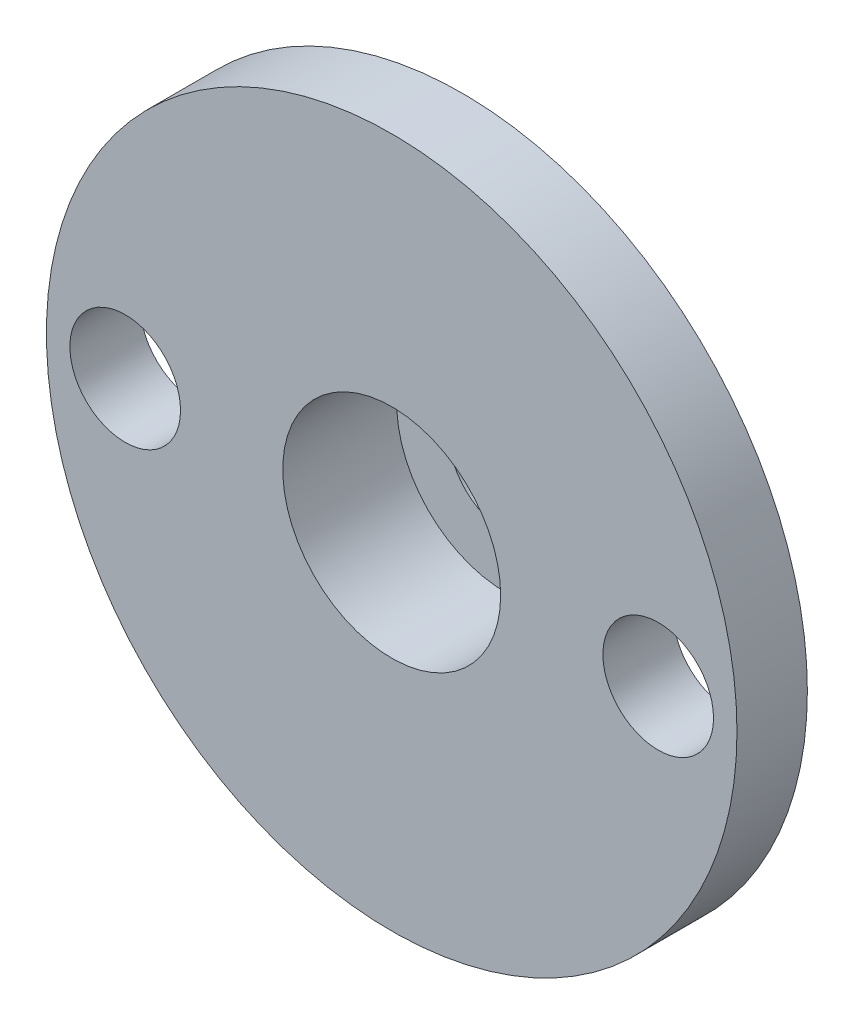
ISO-10303-21;
HEADER;
FILE_DESCRIPTION(('STEP AP214'),'2;1');
FILE_NAME('part.step','',(''),(''),'','','');
FILE_SCHEMA(('AUTOMOTIVE_DESIGN { 1 0 10303 214 1 1 1 1 }'));
ENDSEC;
DATA;
#1=APPLICATION_CONTEXT('core data for automotive mechanical design processes');
#2=APPLICATION_PROTOCOL_DEFINITION('international standard','automotive_design',2000,#1);
#3=PRODUCT_CONTEXT('',#1,'mechanical');
#4=PRODUCT('Part','Part','',(#3));
#5=PRODUCT_RELATED_PRODUCT_CATEGORY('part','',(#4));
#6=PRODUCT_DEFINITION_FORMATION('','',#4);
#7=PRODUCT_DEFINITION_CONTEXT('part definition',#1,'design');
#8=PRODUCT_DEFINITION('design','',#6,#7);
#9=PRODUCT_DEFINITION_SHAPE('','',#8);
#10=(LENGTH_UNIT() NAMED_UNIT(*) SI_UNIT(.MILLI.,.METRE.));
#11=(NAMED_UNIT(*) PLANE_ANGLE_UNIT() SI_UNIT($,.RADIAN.));
#12=(NAMED_UNIT(*) SI_UNIT($,.STERADIAN.) SOLID_ANGLE_UNIT());
#13=UNCERTAINTY_MEASURE_WITH_UNIT(LENGTH_MEASURE(1.E-05),#10,'distance_accuracy_value','');
#14=(GEOMETRIC_REPRESENTATION_CONTEXT(3) GLOBAL_UNCERTAINTY_ASSIGNED_CONTEXT((#13)) GLOBAL_UNIT_ASSIGNED_CONTEXT((#10,
#11,#12)) REPRESENTATION_CONTEXT('',''));
#15=CARTESIAN_POINT('',(0.,0.,0.));
#16=DIRECTION('',(0.,0.,1.));
#17=DIRECTION('',(1.,0.,0.));
#18=AXIS2_PLACEMENT_3D('',#15,#16,#17);
#19=CARTESIAN_POINT('',(0.,0.,2.1));
#20=DIRECTION('',(0.,0.,-1.));
#21=DIRECTION('',(-1.,0.,0.));
#22=AXIS2_PLACEMENT_3D('',#19,#20,#21);
#23=CYLINDRICAL_SURFACE('',#22,10.3);
#24=CARTESIAN_POINT('',(0.,0.,2.1));
#25=DIRECTION('',(0.,0.,1.));
#26=DIRECTION('',(1.,0.,0.));
#27=AXIS2_PLACEMENT_3D('',#24,#25,#26);
#28=CIRCLE('',#27,10.3);
#29=CARTESIAN_POINT('',(10.3,0.,2.1));
#30=VERTEX_POINT('',#29);
#31=EDGE_CURVE('E10',#30,#30,#28,.T.);
#32=ORIENTED_EDGE('',*,*,#31,.F.);
#33=EDGE_LOOP('',(#32));
#34=FACE_BOUND('',#33,.T.);
#35=CARTESIAN_POINT('',(0.,0.,0.));
#36=DIRECTION('',(0.,0.,1.));
#37=DIRECTION('',(1.,0.,0.));
#38=AXIS2_PLACEMENT_3D('',#35,#36,#37);
#39=CIRCLE('',#38,10.3);
#40=CARTESIAN_POINT('',(10.3,0.,0.));
#41=VERTEX_POINT('',#40);
#42=EDGE_CURVE('E42',#41,#41,#39,.T.);
#43=ORIENTED_EDGE('',*,*,#42,.T.);
#44=EDGE_LOOP('',(#43));
#45=FACE_BOUND('',#44,.T.);
#46=ADVANCED_FACE('F35',(#34,#45),#23,.T.);
#47=CARTESIAN_POINT('',(0.,0.,2.1));
#48=DIRECTION('',(0.,0.,1.));
#49=DIRECTION('',(1.,0.,0.));
#50=AXIS2_PLACEMENT_3D('',#47,#48,#49);
#51=PLANE('',#50);
#52=CARTESIAN_POINT('',(0.,0.,2.1));
#53=DIRECTION('',(0.,0.,1.));
#54=DIRECTION('',(1.,0.,0.));
#55=AXIS2_PLACEMENT_3D('',#52,#53,#54);
#56=CIRCLE('',#55,3.25);
#57=CARTESIAN_POINT('',(3.25,0.,2.1));
#58=VERTEX_POINT('',#57);
#59=EDGE_CURVE('E104',#58,#58,#56,.T.);
#60=ORIENTED_EDGE('',*,*,#59,.F.);
#61=EDGE_LOOP('',(#60));
#62=FACE_BOUND('',#61,.T.);
#63=CARTESIAN_POINT('',(7.95,0.,2.1));
#64=DIRECTION('',(0.,0.,1.));
#65=DIRECTION('',(1.,0.,0.));
#66=AXIS2_PLACEMENT_3D('',#63,#64,#65);
#67=CIRCLE('',#66,1.65);
#68=CARTESIAN_POINT('',(9.6,0.,2.1));
#69=VERTEX_POINT('',#68);
#70=EDGE_CURVE('E54',#69,#69,#67,.T.);
#71=ORIENTED_EDGE('',*,*,#70,.F.);
#72=EDGE_LOOP('',(#71));
#73=FACE_BOUND('',#72,.T.);
#74=CARTESIAN_POINT('',(-7.95,0.,2.1));
#75=DIRECTION('',(0.,0.,1.));
#76=DIRECTION('',(1.,0.,0.));
#77=AXIS2_PLACEMENT_3D('',#74,#75,#76);
#78=CIRCLE('',#77,1.65);
#79=CARTESIAN_POINT('',(-6.3,0.,2.1));
#80=VERTEX_POINT('',#79);
#81=EDGE_CURVE('E59',#80,#80,#78,.T.);
#82=ORIENTED_EDGE('',*,*,#81,.F.);
#83=EDGE_LOOP('',(#82));
#84=FACE_BOUND('',#83,.T.);
#85=ORIENTED_EDGE('',*,*,#31,.T.);
#86=EDGE_LOOP('',(#85));
#87=FACE_BOUND('',#86,.T.);
#88=ADVANCED_FACE('F88',(#62,#73,#84,#87),#51,.T.);
#89=CARTESIAN_POINT('',(0.,0.,0.));
#90=DIRECTION('',(0.,0.,1.));
#91=DIRECTION('',(1.,0.,0.));
#92=AXIS2_PLACEMENT_3D('',#89,#90,#91);
#93=PLANE('',#92);
#94=CARTESIAN_POINT('',(7.95,0.,0.));
#95=DIRECTION('',(0.,0.,1.));
#96=DIRECTION('',(1.,0.,0.));
#97=AXIS2_PLACEMENT_3D('',#94,#95,#96);
#98=CIRCLE('',#97,1.65);
#99=CARTESIAN_POINT('',(9.6,0.,0.));
#100=VERTEX_POINT('',#99);
#101=EDGE_CURVE('E38',#100,#100,#98,.T.);
#102=ORIENTED_EDGE('',*,*,#101,.T.);
#103=EDGE_LOOP('',(#102));
#104=FACE_BOUND('',#103,.T.);
#105=CARTESIAN_POINT('',(-7.95,0.,0.));
#106=DIRECTION('',(0.,0.,1.));
#107=DIRECTION('',(1.,0.,0.));
#108=AXIS2_PLACEMENT_3D('',#105,#106,#107);
#109=CIRCLE('',#108,1.65);
#110=CARTESIAN_POINT('',(-6.3,0.,0.));
#111=VERTEX_POINT('',#110);
#112=EDGE_CURVE('E52',#111,#111,#109,.T.);
#113=ORIENTED_EDGE('',*,*,#112,.T.);
#114=EDGE_LOOP('',(#113));
#115=FACE_BOUND('',#114,.T.);
#116=CARTESIAN_POINT('',(0.,0.,0.));
#117=DIRECTION('',(0.,0.,1.));
#118=DIRECTION('',(1.,0.,0.));
#119=AXIS2_PLACEMENT_3D('',#116,#117,#118);
#120=CIRCLE('',#119,4.8);
#121=CARTESIAN_POINT('',(4.8,0.,0.));
#122=VERTEX_POINT('',#121);
#123=EDGE_CURVE('E50',#122,#122,#120,.T.);
#124=ORIENTED_EDGE('',*,*,#123,.T.);
#125=EDGE_LOOP('',(#124));
#126=FACE_BOUND('',#125,.T.);
#127=ORIENTED_EDGE('',*,*,#42,.F.);
#128=EDGE_LOOP('',(#127));
#129=FACE_BOUND('',#128,.T.);
#130=ADVANCED_FACE('F74',(#104,#115,#126,#129),#93,.F.);
#131=CARTESIAN_POINT('',(0.,0.,-3.3));
#132=DIRECTION('',(0.,0.,1.));
#133=DIRECTION('',(1.,0.,0.));
#134=AXIS2_PLACEMENT_3D('',#131,#132,#133);
#135=CYLINDRICAL_SURFACE('',#134,4.8);
#136=CARTESIAN_POINT('',(0.,0.,-3.3));
#137=DIRECTION('',(0.,0.,1.));
#138=DIRECTION('',(1.,0.,0.));
#139=AXIS2_PLACEMENT_3D('',#136,#137,#138);
#140=CIRCLE('',#139,4.8);
#141=CARTESIAN_POINT('',(4.8,0.,-3.3));
#142=VERTEX_POINT('',#141);
#143=EDGE_CURVE('E47',#142,#142,#140,.T.);
#144=ORIENTED_EDGE('',*,*,#143,.T.);
#145=EDGE_LOOP('',(#144));
#146=FACE_BOUND('',#145,.T.);
#147=ORIENTED_EDGE('',*,*,#123,.F.);
#148=EDGE_LOOP('',(#147));
#149=FACE_BOUND('',#148,.T.);
#150=ADVANCED_FACE('F77',(#146,#149),#135,.T.);
#151=CARTESIAN_POINT('',(0.,0.,-3.3));
#152=DIRECTION('',(0.,0.,1.));
#153=DIRECTION('',(1.,0.,0.));
#154=AXIS2_PLACEMENT_3D('',#151,#152,#153);
#155=PLANE('',#154);
#156=CARTESIAN_POINT('',(0.,0.,-3.3));
#157=DIRECTION('',(0.,0.,1.));
#158=DIRECTION('',(1.,0.,0.));
#159=AXIS2_PLACEMENT_3D('',#156,#157,#158);
#160=CIRCLE('',#159,1.7);
#161=CARTESIAN_POINT('',(1.7,0.,-3.3));
#162=VERTEX_POINT('',#161);
#163=EDGE_CURVE('E64',#162,#162,#160,.T.);
#164=ORIENTED_EDGE('',*,*,#163,.T.);
#165=EDGE_LOOP('',(#164));
#166=FACE_BOUND('',#165,.T.);
#167=ORIENTED_EDGE('',*,*,#143,.F.);
#168=EDGE_LOOP('',(#167));
#169=FACE_BOUND('',#168,.T.);
#170=ADVANCED_FACE('F79',(#166,#169),#155,.F.);
#171=CARTESIAN_POINT('',(-7.95,0.,-3.3));
#172=DIRECTION('',(0.,0.,1.));
#173=DIRECTION('',(1.,0.,0.));
#174=AXIS2_PLACEMENT_3D('',#171,#172,#173);
#175=CYLINDRICAL_SURFACE('',#174,1.65);
#176=CARTESIAN_POINT('',(-6.3,0.,2.1));
#177=CARTESIAN_POINT('',(-6.3,0.,2.078125));
#178=CARTESIAN_POINT('',(-6.3,0.,2.05625));
#179=CARTESIAN_POINT('',(-6.3,0.,2.0125));
#180=CARTESIAN_POINT('',(-6.3,0.,1.990625));
#181=CARTESIAN_POINT('',(-6.3,0.,1.946875));
#182=CARTESIAN_POINT('',(-6.3,0.,1.925));
#183=CARTESIAN_POINT('',(-6.3,0.,1.88125));
#184=CARTESIAN_POINT('',(-6.3,0.,1.859375));
#185=CARTESIAN_POINT('',(-6.3,0.,1.815625));
#186=CARTESIAN_POINT('',(-6.3,0.,1.79375));
#187=CARTESIAN_POINT('',(-6.3,0.,1.75));
#188=CARTESIAN_POINT('',(-6.3,0.,1.728125));
#189=CARTESIAN_POINT('',(-6.3,0.,1.684375));
#190=CARTESIAN_POINT('',(-6.3,0.,1.6625));
#191=CARTESIAN_POINT('',(-6.3,0.,1.61875));
#192=CARTESIAN_POINT('',(-6.3,0.,1.596875));
#193=CARTESIAN_POINT('',(-6.3,0.,1.553125));
#194=CARTESIAN_POINT('',(-6.3,0.,1.53125));
#195=CARTESIAN_POINT('',(-6.3,0.,1.4875));
#196=CARTESIAN_POINT('',(-6.3,0.,1.465625));
#197=CARTESIAN_POINT('',(-6.3,0.,1.421875));
#198=CARTESIAN_POINT('',(-6.3,0.,1.4));
#199=CARTESIAN_POINT('',(-6.3,0.,1.35625));
#200=CARTESIAN_POINT('',(-6.3,0.,1.334375));
#201=CARTESIAN_POINT('',(-6.3,0.,1.290625));
#202=CARTESIAN_POINT('',(-6.3,0.,1.26875));
#203=CARTESIAN_POINT('',(-6.3,0.,1.225));
#204=CARTESIAN_POINT('',(-6.3,0.,1.203125));
#205=CARTESIAN_POINT('',(-6.3,0.,1.159375));
#206=CARTESIAN_POINT('',(-6.3,0.,1.1375));
#207=CARTESIAN_POINT('',(-6.3,0.,1.09375));
#208=CARTESIAN_POINT('',(-6.3,0.,1.071875));
#209=CARTESIAN_POINT('',(-6.3,0.,1.028125));
#210=CARTESIAN_POINT('',(-6.3,0.,1.00625));
#211=CARTESIAN_POINT('',(-6.3,0.,0.962499999999999));
#212=CARTESIAN_POINT('',(-6.3,0.,0.940624999999999));
#213=CARTESIAN_POINT('',(-6.3,0.,0.896875));
#214=CARTESIAN_POINT('',(-6.3,0.,0.875));
#215=CARTESIAN_POINT('',(-6.3,0.,0.831249999999999));
#216=CARTESIAN_POINT('',(-6.3,0.,0.809374999999999));
#217=CARTESIAN_POINT('',(-6.3,0.,0.765624999999999));
#218=CARTESIAN_POINT('',(-6.3,0.,0.743749999999999));
#219=CARTESIAN_POINT('',(-6.3,0.,0.699999999999999));
#220=CARTESIAN_POINT('',(-6.3,0.,0.678124999999999));
#221=CARTESIAN_POINT('',(-6.3,0.,0.634374999999999));
#222=CARTESIAN_POINT('',(-6.3,0.,0.612499999999999));
#223=CARTESIAN_POINT('',(-6.3,0.,0.56875));
#224=CARTESIAN_POINT('',(-6.3,0.,0.546875));
#225=CARTESIAN_POINT('',(-6.3,0.,0.503125));
#226=CARTESIAN_POINT('',(-6.3,0.,0.48125));
#227=CARTESIAN_POINT('',(-6.3,0.,0.4375));
#228=CARTESIAN_POINT('',(-6.3,0.,0.415625));
#229=CARTESIAN_POINT('',(-6.3,0.,0.371875));
#230=CARTESIAN_POINT('',(-6.3,0.,0.35));
#231=CARTESIAN_POINT('',(-6.3,0.,0.30625));
#232=CARTESIAN_POINT('',(-6.3,0.,0.284375));
#233=CARTESIAN_POINT('',(-6.3,0.,0.240625));
#234=CARTESIAN_POINT('',(-6.3,0.,0.21875));
#235=CARTESIAN_POINT('',(-6.3,0.,0.175));
#236=CARTESIAN_POINT('',(-6.3,0.,0.153124999999999));
#237=CARTESIAN_POINT('',(-6.3,0.,0.109375));
#238=CARTESIAN_POINT('',(-6.3,0.,0.0874999999999996));
#239=CARTESIAN_POINT('',(-6.3,0.,0.0437499999999997));
#240=CARTESIAN_POINT('',(-6.3,0.,0.0218749999999996));
#241=CARTESIAN_POINT('',(-6.3,0.,0.));
#242=B_SPLINE_CURVE_WITH_KNOTS('',3,(#176,#177,#178,#179,#180,#181,#182,#183,#184,#185,#186,
#187,#188,#189,#190,#191,#192,#193,#194,#195,#196,#197,#198,#199,#200,#201,#202,#203,#204,#205,
#206,#207,#208,#209,#210,#211,#212,#213,#214,#215,#216,#217,#218,#219,#220,#221,#222,#223,#224,
#225,#226,#227,#228,#229,#230,#231,#232,#233,#234,#235,#236,#237,#238,#239,#240,#241),
.UNSPECIFIED.,.F.,.F.,(4,2,2,2,2,2,2,2,2,2,2,2,2,2,2,2,2,2,2,2,2,2,2,2,2,2,2,2,2,2,2,2,4),(0.,
0.0656249999999997,0.13125,0.196875,0.2625,0.328125,0.39375,0.459375,0.525,0.590625,
0.656250000000001,0.721875,0.7875,0.853125,0.91875,0.984375,1.05,1.115625,1.18125,1.246875,
1.3125,1.378125,1.44375,1.509375,1.575,1.640625,1.70625,1.771875,1.8375,1.903125,1.96875,
2.034375,2.1),.UNSPECIFIED.);
#243=EDGE_CURVE('BSEAM85',#80,#111,#242,.T.);
#244=ORIENTED_EDGE('',*,*,#81,.T.);
#245=ORIENTED_EDGE('',*,*,#112,.F.);
#246=ORIENTED_EDGE('',*,*,#243,.T.);
#247=ORIENTED_EDGE('',*,*,#243,.F.);
#248=EDGE_LOOP('',(#244,#246,#245,#247));
#249=FACE_BOUND('',#248,.T.);
#250=ADVANCED_FACE('F85',(#249),#175,.F.);
#251=CARTESIAN_POINT('',(7.95,0.,-3.3));
#252=DIRECTION('',(0.,0.,1.));
#253=DIRECTION('',(1.,0.,0.));
#254=AXIS2_PLACEMENT_3D('',#251,#252,#253);
#255=CYLINDRICAL_SURFACE('',#254,1.65);
#256=CARTESIAN_POINT('',(9.6,0.,2.1));
#257=CARTESIAN_POINT('',(9.6,0.,2.078125));
#258=CARTESIAN_POINT('',(9.6,0.,2.05625));
#259=CARTESIAN_POINT('',(9.6,0.,2.0125));
#260=CARTESIAN_POINT('',(9.6,0.,1.990625));
#261=CARTESIAN_POINT('',(9.6,0.,1.946875));
#262=CARTESIAN_POINT('',(9.6,0.,1.925));
#263=CARTESIAN_POINT('',(9.6,0.,1.88125));
#264=CARTESIAN_POINT('',(9.6,0.,1.859375));
#265=CARTESIAN_POINT('',(9.6,0.,1.815625));
#266=CARTESIAN_POINT('',(9.6,0.,1.79375));
#267=CARTESIAN_POINT('',(9.6,0.,1.75));
#268=CARTESIAN_POINT('',(9.6,0.,1.728125));
#269=CARTESIAN_POINT('',(9.6,0.,1.684375));
#270=CARTESIAN_POINT('',(9.6,0.,1.6625));
#271=CARTESIAN_POINT('',(9.6,0.,1.61875));
#272=CARTESIAN_POINT('',(9.6,0.,1.596875));
#273=CARTESIAN_POINT('',(9.6,0.,1.553125));
#274=CARTESIAN_POINT('',(9.6,0.,1.53125));
#275=CARTESIAN_POINT('',(9.6,0.,1.4875));
#276=CARTESIAN_POINT('',(9.6,0.,1.465625));
#277=CARTESIAN_POINT('',(9.6,0.,1.421875));
#278=CARTESIAN_POINT('',(9.6,0.,1.4));
#279=CARTESIAN_POINT('',(9.6,0.,1.35625));
#280=CARTESIAN_POINT('',(9.6,0.,1.334375));
#281=CARTESIAN_POINT('',(9.6,0.,1.290625));
#282=CARTESIAN_POINT('',(9.6,0.,1.26875));
#283=CARTESIAN_POINT('',(9.6,0.,1.225));
#284=CARTESIAN_POINT('',(9.6,0.,1.203125));
#285=CARTESIAN_POINT('',(9.6,0.,1.159375));
#286=CARTESIAN_POINT('',(9.6,0.,1.1375));
#287=CARTESIAN_POINT('',(9.6,0.,1.09375));
#288=CARTESIAN_POINT('',(9.6,0.,1.071875));
#289=CARTESIAN_POINT('',(9.6,0.,1.028125));
#290=CARTESIAN_POINT('',(9.6,0.,1.00625));
#291=CARTESIAN_POINT('',(9.6,0.,0.962499999999999));
#292=CARTESIAN_POINT('',(9.6,0.,0.940624999999999));
#293=CARTESIAN_POINT('',(9.6,0.,0.896875));
#294=CARTESIAN_POINT('',(9.6,0.,0.875));
#295=CARTESIAN_POINT('',(9.6,0.,0.831249999999999));
#296=CARTESIAN_POINT('',(9.6,0.,0.809374999999999));
#297=CARTESIAN_POINT('',(9.6,0.,0.765624999999999));
#298=CARTESIAN_POINT('',(9.6,0.,0.743749999999999));
#299=CARTESIAN_POINT('',(9.6,0.,0.699999999999999));
#300=CARTESIAN_POINT('',(9.6,0.,0.678124999999999));
#301=CARTESIAN_POINT('',(9.6,0.,0.634374999999999));
#302=CARTESIAN_POINT('',(9.6,0.,0.612499999999999));
#303=CARTESIAN_POINT('',(9.6,0.,0.56875));
#304=CARTESIAN_POINT('',(9.6,0.,0.546875));
#305=CARTESIAN_POINT('',(9.6,0.,0.503125));
#306=CARTESIAN_POINT('',(9.6,0.,0.48125));
#307=CARTESIAN_POINT('',(9.6,0.,0.4375));
#308=CARTESIAN_POINT('',(9.6,0.,0.415625));
#309=CARTESIAN_POINT('',(9.6,0.,0.371875));
#310=CARTESIAN_POINT('',(9.6,0.,0.35));
#311=CARTESIAN_POINT('',(9.6,0.,0.30625));
#312=CARTESIAN_POINT('',(9.6,0.,0.284375));
#313=CARTESIAN_POINT('',(9.6,0.,0.240625));
#314=CARTESIAN_POINT('',(9.6,0.,0.21875));
#315=CARTESIAN_POINT('',(9.6,0.,0.175));
#316=CARTESIAN_POINT('',(9.6,0.,0.153124999999999));
#317=CARTESIAN_POINT('',(9.6,0.,0.109375));
#318=CARTESIAN_POINT('',(9.6,0.,0.0874999999999996));
#319=CARTESIAN_POINT('',(9.6,0.,0.0437499999999997));
#320=CARTESIAN_POINT('',(9.6,0.,0.0218749999999996));
#321=CARTESIAN_POINT('',(9.6,0.,0.));
#322=B_SPLINE_CURVE_WITH_KNOTS('',3,(#256,#257,#258,#259,#260,#261,#262,#263,#264,#265,#266,
#267,#268,#269,#270,#271,#272,#273,#274,#275,#276,#277,#278,#279,#280,#281,#282,#283,#284,#285,
#286,#287,#288,#289,#290,#291,#292,#293,#294,#295,#296,#297,#298,#299,#300,#301,#302,#303,#304,
#305,#306,#307,#308,#309,#310,#311,#312,#313,#314,#315,#316,#317,#318,#319,#320,#321),
.UNSPECIFIED.,.F.,.F.,(4,2,2,2,2,2,2,2,2,2,2,2,2,2,2,2,2,2,2,2,2,2,2,2,2,2,2,2,2,2,2,2,4),(0.,
0.0656249999999997,0.13125,0.196875,0.2625,0.328125,0.39375,0.459375,0.525,0.590625,
0.656250000000001,0.721875,0.7875,0.853125,0.91875,0.984375,1.05,1.115625,1.18125,1.246875,
1.3125,1.378125,1.44375,1.509375,1.575,1.640625,1.70625,1.771875,1.8375,1.903125,1.96875,
2.034375,2.1),.UNSPECIFIED.);
#323=EDGE_CURVE('BSEAM110',#69,#100,#322,.T.);
#324=ORIENTED_EDGE('',*,*,#70,.T.);
#325=ORIENTED_EDGE('',*,*,#101,.F.);
#326=ORIENTED_EDGE('',*,*,#323,.T.);
#327=ORIENTED_EDGE('',*,*,#323,.F.);
#328=EDGE_LOOP('',(#324,#326,#325,#327));
#329=FACE_BOUND('',#328,.T.);
#330=ADVANCED_FACE('F110',(#329),#255,.F.);
#331=CARTESIAN_POINT('',(0.,0.,2.1));
#332=DIRECTION('',(0.,0.,1.));
#333=DIRECTION('',(1.,0.,0.));
#334=AXIS2_PLACEMENT_3D('',#331,#332,#333);
#335=CYLINDRICAL_SURFACE('',#334,1.7);
#336=ORIENTED_EDGE('',*,*,#163,.F.);
#337=EDGE_LOOP('',(#336));
#338=FACE_BOUND('',#337,.T.);
#339=CARTESIAN_POINT('',(0.,0.,-1.3));
#340=DIRECTION('',(0.,0.,1.));
#341=DIRECTION('',(1.,0.,0.));
#342=AXIS2_PLACEMENT_3D('',#339,#340,#341);
#343=CIRCLE('',#342,1.7);
#344=CARTESIAN_POINT('',(1.7,0.,-1.3));
#345=VERTEX_POINT('',#344);
#346=EDGE_CURVE('E135',#345,#345,#343,.T.);
#347=ORIENTED_EDGE('',*,*,#346,.T.);
#348=EDGE_LOOP('',(#347));
#349=FACE_BOUND('',#348,.T.);
#350=ADVANCED_FACE('F115',(#338,#349),#335,.F.);
#351=CARTESIAN_POINT('',(1.7,0.,-1.3));
#352=DIRECTION('',(0.,0.,-1.));
#353=DIRECTION('',(-1.,0.,0.));
#354=AXIS2_PLACEMENT_3D('',#351,#352,#353);
#355=PLANE('',#354);
#356=ORIENTED_EDGE('',*,*,#346,.F.);
#357=EDGE_LOOP('',(#356));
#358=FACE_BOUND('',#357,.T.);
#359=CARTESIAN_POINT('',(0.,0.,-1.3));
#360=DIRECTION('',(0.,0.,1.));
#361=DIRECTION('',(1.,0.,0.));
#362=AXIS2_PLACEMENT_3D('',#359,#360,#361);
#363=CIRCLE('',#362,3.25);
#364=CARTESIAN_POINT('',(3.25,0.,-1.3));
#365=VERTEX_POINT('',#364);
#366=EDGE_CURVE('E133',#365,#365,#363,.T.);
#367=ORIENTED_EDGE('',*,*,#366,.T.);
#368=EDGE_LOOP('',(#367));
#369=FACE_BOUND('',#368,.T.);
#370=ADVANCED_FACE('F120',(#358,#369),#355,.F.);
#371=CARTESIAN_POINT('',(0.,0.,2.1));
#372=DIRECTION('',(0.,0.,1.));
#373=DIRECTION('',(1.,0.,0.));
#374=AXIS2_PLACEMENT_3D('',#371,#372,#373);
#375=CYLINDRICAL_SURFACE('',#374,3.25);
#376=ORIENTED_EDGE('',*,*,#366,.F.);
#377=EDGE_LOOP('',(#376));
#378=FACE_BOUND('',#377,.T.);
#379=ORIENTED_EDGE('',*,*,#59,.T.);
#380=EDGE_LOOP('',(#379));
#381=FACE_BOUND('',#380,.T.);
#382=ADVANCED_FACE('F124',(#378,#381),#375,.F.);
#383=CLOSED_SHELL('',(#46,#88,#130,#150,#170,#250,#330,#350,#370,#382));
#384=MANIFOLD_SOLID_BREP('B2',#383);
#385=ADVANCED_BREP_SHAPE_REPRESENTATION('',(#18,#384),#14);
#386=SHAPE_DEFINITION_REPRESENTATION(#9,#385);
ENDSEC;
END-ISO-10303-21;
